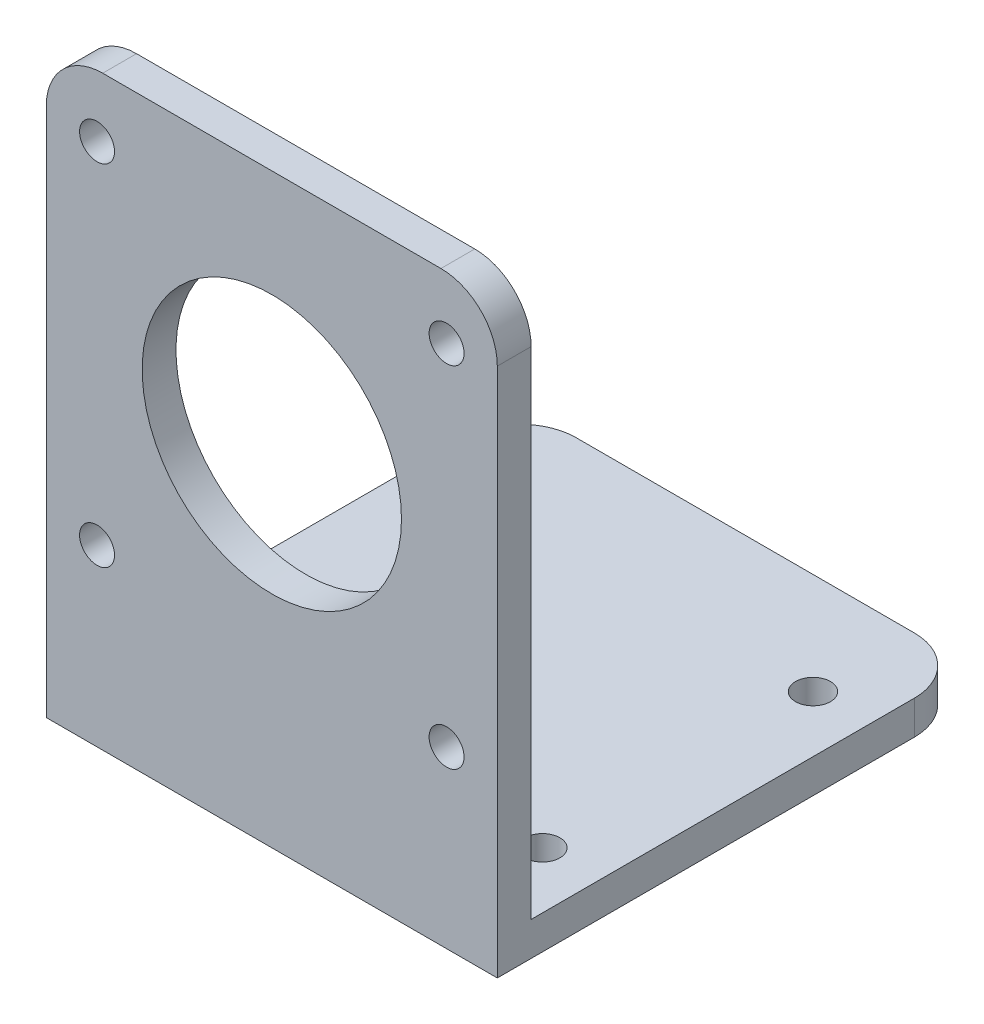
ISO-10303-21;
HEADER;
FILE_DESCRIPTION(('STEP AP214'),'2;1');
FILE_NAME('part.step','',(''),(''),'','','');
FILE_SCHEMA(('AUTOMOTIVE_DESIGN { 1 0 10303 214 1 1 1 1 }'));
ENDSEC;
DATA;
#1=APPLICATION_CONTEXT('core data for automotive mechanical design processes');
#2=APPLICATION_PROTOCOL_DEFINITION('international standard','automotive_design',2000,#1);
#3=PRODUCT_CONTEXT('',#1,'mechanical');
#4=PRODUCT('Part','Part','',(#3));
#5=PRODUCT_RELATED_PRODUCT_CATEGORY('part','',(#4));
#6=PRODUCT_DEFINITION_FORMATION('','',#4);
#7=PRODUCT_DEFINITION_CONTEXT('part definition',#1,'design');
#8=PRODUCT_DEFINITION('design','',#6,#7);
#9=PRODUCT_DEFINITION_SHAPE('','',#8);
#10=(LENGTH_UNIT() NAMED_UNIT(*) SI_UNIT(.MILLI.,.METRE.));
#11=(NAMED_UNIT(*) PLANE_ANGLE_UNIT() SI_UNIT($,.RADIAN.));
#12=(NAMED_UNIT(*) SI_UNIT($,.STERADIAN.) SOLID_ANGLE_UNIT());
#13=UNCERTAINTY_MEASURE_WITH_UNIT(LENGTH_MEASURE(1.E-05),#10,'distance_accuracy_value','');
#14=(GEOMETRIC_REPRESENTATION_CONTEXT(3) GLOBAL_UNCERTAINTY_ASSIGNED_CONTEXT((#13)) GLOBAL_UNIT_ASSIGNED_CONTEXT((#10,
#11,#12)) REPRESENTATION_CONTEXT('',''));
#15=CARTESIAN_POINT('',(0.,0.,0.));
#16=DIRECTION('',(0.,0.,1.));
#17=DIRECTION('',(1.,0.,0.));
#18=AXIS2_PLACEMENT_3D('',#15,#16,#17);
#19=CARTESIAN_POINT('',(-20.,0.,-42.));
#20=DIRECTION('',(0.,-1.,0.));
#21=DIRECTION('',(0.,0.,-1.));
#22=AXIS2_PLACEMENT_3D('',#19,#20,#21);
#23=PLANE('',#22);
#24=CARTESIAN_POINT('',(-15.,0.,-33.));
#25=DIRECTION('',(0.,1.,0.));
#26=DIRECTION('',(0.,0.,-1.));
#27=AXIS2_PLACEMENT_3D('',#24,#25,#26);
#28=CIRCLE('',#27,1.55);
#29=CARTESIAN_POINT('',(-15.,0.,-34.55));
#30=VERTEX_POINT('',#29);
#31=EDGE_CURVE('E247',#30,#30,#28,.T.);
#32=ORIENTED_EDGE('',*,*,#31,.T.);
#33=EDGE_LOOP('',(#32));
#34=FACE_BOUND('',#33,.T.);
#35=CARTESIAN_POINT('',(-15.,0.,-9.));
#36=DIRECTION('',(0.,1.,0.));
#37=DIRECTION('',(0.,0.,-1.));
#38=AXIS2_PLACEMENT_3D('',#35,#36,#37);
#39=CIRCLE('',#38,1.55);
#40=CARTESIAN_POINT('',(-15.,0.,-10.55));
#41=VERTEX_POINT('',#40);
#42=EDGE_CURVE('E246',#41,#41,#39,.T.);
#43=ORIENTED_EDGE('',*,*,#42,.T.);
#44=EDGE_LOOP('',(#43));
#45=FACE_BOUND('',#44,.T.);
#46=CARTESIAN_POINT('',(15.,0.,-9.));
#47=DIRECTION('',(0.,1.,0.));
#48=DIRECTION('',(0.,0.,1.));
#49=AXIS2_PLACEMENT_3D('',#46,#47,#48);
#50=CIRCLE('',#49,1.55);
#51=CARTESIAN_POINT('',(15.,0.,-7.45));
#52=VERTEX_POINT('',#51);
#53=EDGE_CURVE('E253',#52,#52,#50,.T.);
#54=ORIENTED_EDGE('',*,*,#53,.T.);
#55=EDGE_LOOP('',(#54));
#56=FACE_BOUND('',#55,.T.);
#57=CARTESIAN_POINT('',(15.,0.,-33.));
#58=DIRECTION('',(0.,1.,0.));
#59=DIRECTION('',(0.,0.,1.));
#60=AXIS2_PLACEMENT_3D('',#57,#58,#59);
#61=CIRCLE('',#60,1.55);
#62=CARTESIAN_POINT('',(15.,0.,-31.45));
#63=VERTEX_POINT('',#62);
#64=EDGE_CURVE('E239',#63,#63,#61,.T.);
#65=ORIENTED_EDGE('',*,*,#64,.T.);
#66=EDGE_LOOP('',(#65));
#67=FACE_BOUND('',#66,.T.);
#68=DIRECTION('',(1.,0.,0.));
#69=VECTOR('',#68,1.);
#70=CARTESIAN_POINT('',(-20.,0.,-42.));
#71=LINE('',#70,#69);
#72=CARTESIAN_POINT('',(-15.,0.,-42.));
#73=VERTEX_POINT('',#72);
#74=CARTESIAN_POINT('',(15.,0.,-42.));
#75=VERTEX_POINT('',#74);
#76=EDGE_CURVE('E141',#73,#75,#71,.T.);
#77=ORIENTED_EDGE('',*,*,#76,.T.);
#78=CARTESIAN_POINT('',(15.,0.,-37.));
#79=DIRECTION('',(0.,-1.,0.));
#80=DIRECTION('',(0.,0.,-1.));
#81=AXIS2_PLACEMENT_3D('',#78,#79,#80);
#82=CIRCLE('',#81,5.);
#83=CARTESIAN_POINT('',(20.,0.,-37.));
#84=VERTEX_POINT('',#83);
#85=EDGE_CURVE('E11',#75,#84,#82,.T.);
#86=ORIENTED_EDGE('',*,*,#85,.T.);
#87=DIRECTION('',(0.,0.,-1.));
#88=VECTOR('',#87,1.);
#89=CARTESIAN_POINT('',(20.,0.,-42.));
#90=LINE('',#89,#88);
#91=CARTESIAN_POINT('',(20.,0.,0.));
#92=VERTEX_POINT('',#91);
#93=EDGE_CURVE('E145',#92,#84,#90,.T.);
#94=ORIENTED_EDGE('',*,*,#93,.F.);
#95=DIRECTION('',(1.,0.,0.));
#96=VECTOR('',#95,1.);
#97=CARTESIAN_POINT('',(-20.,0.,0.));
#98=LINE('',#97,#96);
#99=CARTESIAN_POINT('',(-20.,0.,0.));
#100=VERTEX_POINT('',#99);
#101=EDGE_CURVE('E154',#100,#92,#98,.T.);
#102=ORIENTED_EDGE('',*,*,#101,.F.);
#103=DIRECTION('',(0.,0.,-1.));
#104=VECTOR('',#103,1.);
#105=CARTESIAN_POINT('',(-20.,0.,-42.));
#106=LINE('',#105,#104);
#107=CARTESIAN_POINT('',(-20.,0.,-37.));
#108=VERTEX_POINT('',#107);
#109=EDGE_CURVE('E124',#100,#108,#106,.T.);
#110=ORIENTED_EDGE('',*,*,#109,.T.);
#111=CARTESIAN_POINT('',(-15.,0.,-37.));
#112=DIRECTION('',(0.,-1.,0.));
#113=DIRECTION('',(0.,0.,-1.));
#114=AXIS2_PLACEMENT_3D('',#111,#112,#113);
#115=CIRCLE('',#114,5.);
#116=EDGE_CURVE('E43',#108,#73,#115,.T.);
#117=ORIENTED_EDGE('',*,*,#116,.T.);
#118=EDGE_LOOP('',(#77,#86,#94,#102,#110,#117));
#119=FACE_BOUND('',#118,.T.);
#120=ADVANCED_FACE('F35',(#34,#45,#56,#67,#119),#23,.T.);
#121=CARTESIAN_POINT('',(-20.,0.,0.));
#122=DIRECTION('',(0.,0.,1.));
#123=DIRECTION('',(1.,0.,0.));
#124=AXIS2_PLACEMENT_3D('',#121,#122,#123);
#125=PLANE('',#124);
#126=CARTESIAN_POINT('',(0.,31.,0.));
#127=DIRECTION('',(0.,0.,1.));
#128=DIRECTION('',(1.,0.,0.));
#129=AXIS2_PLACEMENT_3D('',#126,#127,#128);
#130=CIRCLE('',#129,11.5);
#131=CARTESIAN_POINT('',(11.5,31.,0.));
#132=VERTEX_POINT('',#131);
#133=EDGE_CURVE('E216',#132,#132,#130,.T.);
#134=ORIENTED_EDGE('',*,*,#133,.F.);
#135=EDGE_LOOP('',(#134));
#136=FACE_BOUND('',#135,.T.);
#137=CARTESIAN_POINT('',(-15.5,46.5,0.));
#138=DIRECTION('',(0.,0.,1.));
#139=DIRECTION('',(-1.,0.,0.));
#140=AXIS2_PLACEMENT_3D('',#137,#138,#139);
#141=CIRCLE('',#140,1.55);
#142=CARTESIAN_POINT('',(-17.05,46.5,0.));
#143=VERTEX_POINT('',#142);
#144=EDGE_CURVE('E223',#143,#143,#141,.T.);
#145=ORIENTED_EDGE('',*,*,#144,.F.);
#146=EDGE_LOOP('',(#145));
#147=FACE_BOUND('',#146,.T.);
#148=CARTESIAN_POINT('',(-15.5,15.5,0.));
#149=DIRECTION('',(0.,0.,1.));
#150=DIRECTION('',(-1.,0.,0.));
#151=AXIS2_PLACEMENT_3D('',#148,#149,#150);
#152=CIRCLE('',#151,1.55);
#153=CARTESIAN_POINT('',(-17.05,15.5,0.));
#154=VERTEX_POINT('',#153);
#155=EDGE_CURVE('E229',#154,#154,#152,.T.);
#156=ORIENTED_EDGE('',*,*,#155,.F.);
#157=EDGE_LOOP('',(#156));
#158=FACE_BOUND('',#157,.T.);
#159=CARTESIAN_POINT('',(15.5,15.5,0.));
#160=DIRECTION('',(0.,0.,1.));
#161=DIRECTION('',(1.,0.,0.));
#162=AXIS2_PLACEMENT_3D('',#159,#160,#161);
#163=CIRCLE('',#162,1.55);
#164=CARTESIAN_POINT('',(17.05,15.5,0.));
#165=VERTEX_POINT('',#164);
#166=EDGE_CURVE('E210',#165,#165,#163,.T.);
#167=ORIENTED_EDGE('',*,*,#166,.F.);
#168=EDGE_LOOP('',(#167));
#169=FACE_BOUND('',#168,.T.);
#170=CARTESIAN_POINT('',(15.5,46.5,0.));
#171=DIRECTION('',(0.,0.,1.));
#172=DIRECTION('',(1.,0.,0.));
#173=AXIS2_PLACEMENT_3D('',#170,#171,#172);
#174=CIRCLE('',#173,1.55);
#175=CARTESIAN_POINT('',(17.05,46.5,0.));
#176=VERTEX_POINT('',#175);
#177=EDGE_CURVE('E149',#176,#176,#174,.T.);
#178=ORIENTED_EDGE('',*,*,#177,.F.);
#179=EDGE_LOOP('',(#178));
#180=FACE_BOUND('',#179,.T.);
#181=DIRECTION('',(1.,0.,0.));
#182=VECTOR('',#181,1.);
#183=CARTESIAN_POINT('',(-20.,52.,0.));
#184=LINE('',#183,#182);
#185=CARTESIAN_POINT('',(-15.,52.,0.));
#186=VERTEX_POINT('',#185);
#187=CARTESIAN_POINT('',(15.,52.,0.));
#188=VERTEX_POINT('',#187);
#189=EDGE_CURVE('E158',#186,#188,#184,.T.);
#190=ORIENTED_EDGE('',*,*,#189,.F.);
#191=CARTESIAN_POINT('',(-15.,47.,0.));
#192=DIRECTION('',(0.,0.,1.));
#193=DIRECTION('',(1.,0.,0.));
#194=AXIS2_PLACEMENT_3D('',#191,#192,#193);
#195=CIRCLE('',#194,5.);
#196=CARTESIAN_POINT('',(-20.,47.,0.));
#197=VERTEX_POINT('',#196);
#198=EDGE_CURVE('E171',#186,#197,#195,.T.);
#199=ORIENTED_EDGE('',*,*,#198,.T.);
#200=DIRECTION('',(0.,-1.,0.));
#201=VECTOR('',#200,1.);
#202=CARTESIAN_POINT('',(-20.,0.,0.));
#203=LINE('',#202,#201);
#204=EDGE_CURVE('E139',#197,#100,#203,.T.);
#205=ORIENTED_EDGE('',*,*,#204,.T.);
#206=ORIENTED_EDGE('',*,*,#101,.T.);
#207=DIRECTION('',(0.,-1.,0.));
#208=VECTOR('',#207,1.);
#209=CARTESIAN_POINT('',(20.,0.,0.));
#210=LINE('',#209,#208);
#211=CARTESIAN_POINT('',(20.,47.,0.));
#212=VERTEX_POINT('',#211);
#213=EDGE_CURVE('E152',#212,#92,#210,.T.);
#214=ORIENTED_EDGE('',*,*,#213,.F.);
#215=CARTESIAN_POINT('',(15.,47.,0.));
#216=DIRECTION('',(0.,0.,1.));
#217=DIRECTION('',(1.,0.,0.));
#218=AXIS2_PLACEMENT_3D('',#215,#216,#217);
#219=CIRCLE('',#218,5.);
#220=EDGE_CURVE('E169',#212,#188,#219,.T.);
#221=ORIENTED_EDGE('',*,*,#220,.T.);
#222=EDGE_LOOP('',(#190,#199,#205,#206,#214,#221));
#223=FACE_BOUND('',#222,.T.);
#224=ADVANCED_FACE('F280',(#136,#147,#158,#169,#180,#223),#125,.T.);
#225=CARTESIAN_POINT('',(-20.,52.,0.));
#226=DIRECTION('',(0.,1.,0.));
#227=DIRECTION('',(0.,0.,1.));
#228=AXIS2_PLACEMENT_3D('',#225,#226,#227);
#229=PLANE('',#228);
#230=DIRECTION('',(1.,0.,0.));
#231=VECTOR('',#230,1.);
#232=CARTESIAN_POINT('',(-20.,52.,-3.));
#233=LINE('',#232,#231);
#234=CARTESIAN_POINT('',(-15.,52.,-3.));
#235=VERTEX_POINT('',#234);
#236=CARTESIAN_POINT('',(15.,52.,-3.));
#237=VERTEX_POINT('',#236);
#238=EDGE_CURVE('E132',#235,#237,#233,.T.);
#239=ORIENTED_EDGE('',*,*,#238,.F.);
#240=DIRECTION('',(0.,0.,1.));
#241=VECTOR('',#240,1.);
#242=CARTESIAN_POINT('',(-15.,52.,0.));
#243=LINE('',#242,#241);
#244=EDGE_CURVE('E166',#235,#186,#243,.T.);
#245=ORIENTED_EDGE('',*,*,#244,.T.);
#246=ORIENTED_EDGE('',*,*,#189,.T.);
#247=DIRECTION('',(0.,0.,1.));
#248=VECTOR('',#247,1.);
#249=CARTESIAN_POINT('',(15.,52.,-3.));
#250=LINE('',#249,#248);
#251=EDGE_CURVE('E157',#188,#237,#250,.F.);
#252=ORIENTED_EDGE('',*,*,#251,.T.);
#253=EDGE_LOOP('',(#239,#245,#246,#252));
#254=FACE_BOUND('',#253,.T.);
#255=ADVANCED_FACE('F286',(#254),#229,.T.);
#256=CARTESIAN_POINT('',(-20.,52.,-3.));
#257=DIRECTION('',(0.,0.,-1.));
#258=DIRECTION('',(0.,1.,0.));
#259=AXIS2_PLACEMENT_3D('',#256,#257,#258);
#260=PLANE('',#259);
#261=CARTESIAN_POINT('',(0.,31.,-3.));
#262=DIRECTION('',(0.,0.,-1.));
#263=DIRECTION('',(0.,1.,0.));
#264=AXIS2_PLACEMENT_3D('',#261,#262,#263);
#265=CIRCLE('',#264,11.5);
#266=CARTESIAN_POINT('',(0.,42.5,-2.99999999999999));
#267=VERTEX_POINT('',#266);
#268=EDGE_CURVE('E213',#267,#267,#265,.F.);
#269=ORIENTED_EDGE('',*,*,#268,.T.);
#270=EDGE_LOOP('',(#269));
#271=FACE_BOUND('',#270,.T.);
#272=CARTESIAN_POINT('',(-15.5,46.5,-3.));
#273=DIRECTION('',(0.,0.,-1.));
#274=DIRECTION('',(0.,1.,0.));
#275=AXIS2_PLACEMENT_3D('',#272,#273,#274);
#276=CIRCLE('',#275,1.55);
#277=CARTESIAN_POINT('',(-15.5,48.05,-3.));
#278=VERTEX_POINT('',#277);
#279=EDGE_CURVE('E220',#278,#278,#276,.F.);
#280=ORIENTED_EDGE('',*,*,#279,.T.);
#281=EDGE_LOOP('',(#280));
#282=FACE_BOUND('',#281,.T.);
#283=CARTESIAN_POINT('',(-15.5,15.5,-3.));
#284=DIRECTION('',(0.,0.,-1.));
#285=DIRECTION('',(0.,1.,0.));
#286=AXIS2_PLACEMENT_3D('',#283,#284,#285);
#287=CIRCLE('',#286,1.55);
#288=CARTESIAN_POINT('',(-15.5,17.05,-3.));
#289=VERTEX_POINT('',#288);
#290=EDGE_CURVE('E226',#289,#289,#287,.F.);
#291=ORIENTED_EDGE('',*,*,#290,.T.);
#292=EDGE_LOOP('',(#291));
#293=FACE_BOUND('',#292,.T.);
#294=CARTESIAN_POINT('',(15.5,15.5,-3.));
#295=DIRECTION('',(0.,0.,-1.));
#296=DIRECTION('',(0.,1.,0.));
#297=AXIS2_PLACEMENT_3D('',#294,#295,#296);
#298=CIRCLE('',#297,1.55);
#299=CARTESIAN_POINT('',(15.5,17.05,-3.));
#300=VERTEX_POINT('',#299);
#301=EDGE_CURVE('E232',#300,#300,#298,.F.);
#302=ORIENTED_EDGE('',*,*,#301,.T.);
#303=EDGE_LOOP('',(#302));
#304=FACE_BOUND('',#303,.T.);
#305=CARTESIAN_POINT('',(15.5,46.5,-3.));
#306=DIRECTION('',(0.,0.,-1.));
#307=DIRECTION('',(0.,1.,0.));
#308=AXIS2_PLACEMENT_3D('',#305,#306,#307);
#309=CIRCLE('',#308,1.55);
#310=CARTESIAN_POINT('',(15.5,48.05,-3.));
#311=VERTEX_POINT('',#310);
#312=EDGE_CURVE('E207',#311,#311,#309,.F.);
#313=ORIENTED_EDGE('',*,*,#312,.T.);
#314=EDGE_LOOP('',(#313));
#315=FACE_BOUND('',#314,.T.);
#316=DIRECTION('',(0.,1.,0.));
#317=VECTOR('',#316,1.);
#318=CARTESIAN_POINT('',(-20.,52.,-3.));
#319=LINE('',#318,#317);
#320=CARTESIAN_POINT('',(-20.,3.,-3.00000000000001));
#321=VERTEX_POINT('',#320);
#322=CARTESIAN_POINT('',(-20.,47.,-3.));
#323=VERTEX_POINT('',#322);
#324=EDGE_CURVE('E123',#321,#323,#319,.T.);
#325=ORIENTED_EDGE('',*,*,#324,.T.);
#326=CARTESIAN_POINT('',(-15.,47.,-3.));
#327=DIRECTION('',(0.,0.,-1.));
#328=DIRECTION('',(0.,1.,0.));
#329=AXIS2_PLACEMENT_3D('',#326,#327,#328);
#330=CIRCLE('',#329,5.);
#331=EDGE_CURVE('E178',#323,#235,#330,.T.);
#332=ORIENTED_EDGE('',*,*,#331,.T.);
#333=ORIENTED_EDGE('',*,*,#238,.T.);
#334=CARTESIAN_POINT('',(15.,47.,-3.));
#335=DIRECTION('',(0.,0.,-1.));
#336=DIRECTION('',(0.,1.,0.));
#337=AXIS2_PLACEMENT_3D('',#334,#335,#336);
#338=CIRCLE('',#337,5.);
#339=CARTESIAN_POINT('',(20.,47.,-3.));
#340=VERTEX_POINT('',#339);
#341=EDGE_CURVE('E176',#237,#340,#338,.T.);
#342=ORIENTED_EDGE('',*,*,#341,.T.);
#343=DIRECTION('',(0.,1.,0.));
#344=VECTOR('',#343,1.);
#345=CARTESIAN_POINT('',(20.,52.,-3.));
#346=LINE('',#345,#344);
#347=CARTESIAN_POINT('',(20.,3.,-3.00000000000001));
#348=VERTEX_POINT('',#347);
#349=EDGE_CURVE('E131',#348,#340,#346,.T.);
#350=ORIENTED_EDGE('',*,*,#349,.F.);
#351=DIRECTION('',(1.,0.,0.));
#352=VECTOR('',#351,1.);
#353=CARTESIAN_POINT('',(-20.,3.,-3.00000000000001));
#354=LINE('',#353,#352);
#355=EDGE_CURVE('E116',#321,#348,#354,.T.);
#356=ORIENTED_EDGE('',*,*,#355,.F.);
#357=EDGE_LOOP('',(#325,#332,#333,#342,#350,#356));
#358=FACE_BOUND('',#357,.T.);
#359=ADVANCED_FACE('F128',(#271,#282,#293,#304,#315,#358),#260,.T.);
#360=CARTESIAN_POINT('',(-20.,3.,-3.00000000000001));
#361=DIRECTION('',(0.,1.,0.));
#362=DIRECTION('',(0.,0.,1.));
#363=AXIS2_PLACEMENT_3D('',#360,#361,#362);
#364=PLANE('',#363);
#365=CARTESIAN_POINT('',(-15.,3.,-33.));
#366=DIRECTION('',(0.,1.,0.));
#367=DIRECTION('',(0.,0.,1.));
#368=AXIS2_PLACEMENT_3D('',#365,#366,#367);
#369=CIRCLE('',#368,1.55);
#370=CARTESIAN_POINT('',(-15.,3.,-31.45));
#371=VERTEX_POINT('',#370);
#372=EDGE_CURVE('E243',#371,#371,#369,.T.);
#373=ORIENTED_EDGE('',*,*,#372,.F.);
#374=EDGE_LOOP('',(#373));
#375=FACE_BOUND('',#374,.T.);
#376=CARTESIAN_POINT('',(-15.,3.,-9.));
#377=DIRECTION('',(0.,1.,0.));
#378=DIRECTION('',(0.,0.,1.));
#379=AXIS2_PLACEMENT_3D('',#376,#377,#378);
#380=CIRCLE('',#379,1.55);
#381=CARTESIAN_POINT('',(-15.,3.,-7.45));
#382=VERTEX_POINT('',#381);
#383=EDGE_CURVE('E250',#382,#382,#380,.T.);
#384=ORIENTED_EDGE('',*,*,#383,.F.);
#385=EDGE_LOOP('',(#384));
#386=FACE_BOUND('',#385,.T.);
#387=CARTESIAN_POINT('',(15.,3.,-9.));
#388=DIRECTION('',(0.,1.,0.));
#389=DIRECTION('',(0.,0.,1.));
#390=AXIS2_PLACEMENT_3D('',#387,#388,#389);
#391=CIRCLE('',#390,1.55);
#392=CARTESIAN_POINT('',(15.,3.,-7.45));
#393=VERTEX_POINT('',#392);
#394=EDGE_CURVE('E242',#393,#393,#391,.T.);
#395=ORIENTED_EDGE('',*,*,#394,.F.);
#396=EDGE_LOOP('',(#395));
#397=FACE_BOUND('',#396,.T.);
#398=CARTESIAN_POINT('',(15.,3.,-33.));
#399=DIRECTION('',(0.,1.,0.));
#400=DIRECTION('',(0.,0.,1.));
#401=AXIS2_PLACEMENT_3D('',#398,#399,#400);
#402=CIRCLE('',#401,1.55);
#403=CARTESIAN_POINT('',(15.,3.,-31.45));
#404=VERTEX_POINT('',#403);
#405=EDGE_CURVE('E217',#404,#404,#402,.T.);
#406=ORIENTED_EDGE('',*,*,#405,.F.);
#407=EDGE_LOOP('',(#406));
#408=FACE_BOUND('',#407,.T.);
#409=DIRECTION('',(0.,0.,1.));
#410=VECTOR('',#409,1.);
#411=CARTESIAN_POINT('',(20.,3.,-3.00000000000001));
#412=LINE('',#411,#410);
#413=CARTESIAN_POINT('',(20.,3.,-37.));
#414=VERTEX_POINT('',#413);
#415=EDGE_CURVE('E148',#414,#348,#412,.T.);
#416=ORIENTED_EDGE('',*,*,#415,.F.);
#417=CARTESIAN_POINT('',(15.,3.,-37.));
#418=DIRECTION('',(0.,1.,0.));
#419=DIRECTION('',(0.,0.,1.));
#420=AXIS2_PLACEMENT_3D('',#417,#418,#419);
#421=CIRCLE('',#420,5.);
#422=CARTESIAN_POINT('',(15.,3.,-42.));
#423=VERTEX_POINT('',#422);
#424=EDGE_CURVE('E187',#414,#423,#421,.T.);
#425=ORIENTED_EDGE('',*,*,#424,.T.);
#426=DIRECTION('',(1.,0.,0.));
#427=VECTOR('',#426,1.);
#428=CARTESIAN_POINT('',(-20.,3.,-42.));
#429=LINE('',#428,#427);
#430=CARTESIAN_POINT('',(-15.,3.,-42.));
#431=VERTEX_POINT('',#430);
#432=EDGE_CURVE('E133',#431,#423,#429,.T.);
#433=ORIENTED_EDGE('',*,*,#432,.F.);
#434=CARTESIAN_POINT('',(-15.,3.,-37.));
#435=DIRECTION('',(0.,1.,0.));
#436=DIRECTION('',(0.,0.,1.));
#437=AXIS2_PLACEMENT_3D('',#434,#435,#436);
#438=CIRCLE('',#437,5.);
#439=CARTESIAN_POINT('',(-20.,3.,-37.));
#440=VERTEX_POINT('',#439);
#441=EDGE_CURVE('E119',#431,#440,#438,.T.);
#442=ORIENTED_EDGE('',*,*,#441,.T.);
#443=DIRECTION('',(0.,0.,1.));
#444=VECTOR('',#443,1.);
#445=CARTESIAN_POINT('',(-20.,3.,-3.00000000000001));
#446=LINE('',#445,#444);
#447=EDGE_CURVE('E112',#440,#321,#446,.T.);
#448=ORIENTED_EDGE('',*,*,#447,.T.);
#449=ORIENTED_EDGE('',*,*,#355,.T.);
#450=EDGE_LOOP('',(#416,#425,#433,#442,#448,#449));
#451=FACE_BOUND('',#450,.T.);
#452=ADVANCED_FACE('F115',(#375,#386,#397,#408,#451),#364,.T.);
#453=CARTESIAN_POINT('',(-20.,3.,-42.));
#454=DIRECTION('',(0.,0.,-1.));
#455=DIRECTION('',(-1.,0.,0.));
#456=AXIS2_PLACEMENT_3D('',#453,#454,#455);
#457=PLANE('',#456);
#458=ORIENTED_EDGE('',*,*,#432,.T.);
#459=DIRECTION('',(0.,1.,0.));
#460=VECTOR('',#459,1.);
#461=CARTESIAN_POINT('',(15.,0.,-42.));
#462=LINE('',#461,#460);
#463=EDGE_CURVE('E50',#423,#75,#462,.F.);
#464=ORIENTED_EDGE('',*,*,#463,.T.);
#465=ORIENTED_EDGE('',*,*,#76,.F.);
#466=DIRECTION('',(0.,1.,0.));
#467=VECTOR('',#466,1.);
#468=CARTESIAN_POINT('',(-15.,3.,-42.));
#469=LINE('',#468,#467);
#470=EDGE_CURVE('E189',#73,#431,#469,.T.);
#471=ORIENTED_EDGE('',*,*,#470,.T.);
#472=EDGE_LOOP('',(#458,#464,#465,#471));
#473=FACE_BOUND('',#472,.T.);
#474=ADVANCED_FACE('F193',(#473),#457,.T.);
#475=CARTESIAN_POINT('',(-20.,0.,0.));
#476=DIRECTION('',(-1.,0.,0.));
#477=DIRECTION('',(0.,0.,1.));
#478=AXIS2_PLACEMENT_3D('',#475,#476,#477);
#479=PLANE('',#478);
#480=ORIENTED_EDGE('',*,*,#204,.F.);
#481=DIRECTION('',(0.,0.,1.));
#482=VECTOR('',#481,1.);
#483=CARTESIAN_POINT('',(-20.,47.,0.));
#484=LINE('',#483,#482);
#485=EDGE_CURVE('E138',#197,#323,#484,.F.);
#486=ORIENTED_EDGE('',*,*,#485,.T.);
#487=ORIENTED_EDGE('',*,*,#324,.F.);
#488=ORIENTED_EDGE('',*,*,#447,.F.);
#489=DIRECTION('',(0.,1.,0.));
#490=VECTOR('',#489,1.);
#491=CARTESIAN_POINT('',(-20.,0.,-37.));
#492=LINE('',#491,#490);
#493=EDGE_CURVE('E173',#440,#108,#492,.F.);
#494=ORIENTED_EDGE('',*,*,#493,.T.);
#495=ORIENTED_EDGE('',*,*,#109,.F.);
#496=EDGE_LOOP('',(#480,#486,#487,#488,#494,#495));
#497=FACE_BOUND('',#496,.T.);
#498=ADVANCED_FACE('F136',(#497),#479,.T.);
#499=CARTESIAN_POINT('',(20.,0.,0.));
#500=DIRECTION('',(-1.,0.,0.));
#501=DIRECTION('',(0.,0.,1.));
#502=AXIS2_PLACEMENT_3D('',#499,#500,#501);
#503=PLANE('',#502);
#504=ORIENTED_EDGE('',*,*,#349,.T.);
#505=DIRECTION('',(0.,0.,1.));
#506=VECTOR('',#505,1.);
#507=CARTESIAN_POINT('',(20.,47.,0.));
#508=LINE('',#507,#506);
#509=EDGE_CURVE('E183',#340,#212,#508,.T.);
#510=ORIENTED_EDGE('',*,*,#509,.T.);
#511=ORIENTED_EDGE('',*,*,#213,.T.);
#512=ORIENTED_EDGE('',*,*,#93,.T.);
#513=DIRECTION('',(0.,1.,0.));
#514=VECTOR('',#513,1.);
#515=CARTESIAN_POINT('',(20.,3.,-37.));
#516=LINE('',#515,#514);
#517=EDGE_CURVE('E180',#84,#414,#516,.T.);
#518=ORIENTED_EDGE('',*,*,#517,.T.);
#519=ORIENTED_EDGE('',*,*,#415,.T.);
#520=EDGE_LOOP('',(#504,#510,#511,#512,#518,#519));
#521=FACE_BOUND('',#520,.T.);
#522=ADVANCED_FACE('F200',(#521),#503,.F.);
#523=CARTESIAN_POINT('',(15.5,46.5,-42.001));
#524=DIRECTION('',(0.,0.,1.));
#525=DIRECTION('',(1.,0.,0.));
#526=AXIS2_PLACEMENT_3D('',#523,#524,#525);
#527=CYLINDRICAL_SURFACE('',#526,1.55);
#528=ORIENTED_EDGE('',*,*,#312,.F.);
#529=EDGE_LOOP('',(#528));
#530=FACE_BOUND('',#529,.T.);
#531=ORIENTED_EDGE('',*,*,#177,.T.);
#532=EDGE_LOOP('',(#531));
#533=FACE_BOUND('',#532,.T.);
#534=ADVANCED_FACE('F333',(#530,#533),#527,.F.);
#535=CARTESIAN_POINT('',(15.5,15.5,-42.001));
#536=DIRECTION('',(0.,0.,1.));
#537=DIRECTION('',(1.,0.,0.));
#538=AXIS2_PLACEMENT_3D('',#535,#536,#537);
#539=CYLINDRICAL_SURFACE('',#538,1.55);
#540=ORIENTED_EDGE('',*,*,#301,.F.);
#541=EDGE_LOOP('',(#540));
#542=FACE_BOUND('',#541,.T.);
#543=ORIENTED_EDGE('',*,*,#166,.T.);
#544=EDGE_LOOP('',(#543));
#545=FACE_BOUND('',#544,.T.);
#546=ADVANCED_FACE('F438',(#542,#545),#539,.F.);
#547=CARTESIAN_POINT('',(-15.5,15.5,-42.001));
#548=DIRECTION('',(0.,0.,1.));
#549=DIRECTION('',(1.,0.,0.));
#550=AXIS2_PLACEMENT_3D('',#547,#548,#549);
#551=CYLINDRICAL_SURFACE('',#550,1.55);
#552=ORIENTED_EDGE('',*,*,#290,.F.);
#553=EDGE_LOOP('',(#552));
#554=FACE_BOUND('',#553,.T.);
#555=ORIENTED_EDGE('',*,*,#155,.T.);
#556=EDGE_LOOP('',(#555));
#557=FACE_BOUND('',#556,.T.);
#558=ADVANCED_FACE('F428',(#554,#557),#551,.F.);
#559=CARTESIAN_POINT('',(-15.5,46.5,-42.001));
#560=DIRECTION('',(0.,0.,1.));
#561=DIRECTION('',(1.,0.,0.));
#562=AXIS2_PLACEMENT_3D('',#559,#560,#561);
#563=CYLINDRICAL_SURFACE('',#562,1.55);
#564=ORIENTED_EDGE('',*,*,#279,.F.);
#565=EDGE_LOOP('',(#564));
#566=FACE_BOUND('',#565,.T.);
#567=ORIENTED_EDGE('',*,*,#144,.T.);
#568=EDGE_LOOP('',(#567));
#569=FACE_BOUND('',#568,.T.);
#570=ADVANCED_FACE('F418',(#566,#569),#563,.F.);
#571=CARTESIAN_POINT('',(0.,31.,-42.001));
#572=DIRECTION('',(0.,0.,1.));
#573=DIRECTION('',(1.,0.,0.));
#574=AXIS2_PLACEMENT_3D('',#571,#572,#573);
#575=CYLINDRICAL_SURFACE('',#574,11.5);
#576=ORIENTED_EDGE('',*,*,#268,.F.);
#577=EDGE_LOOP('',(#576));
#578=FACE_BOUND('',#577,.T.);
#579=ORIENTED_EDGE('',*,*,#133,.T.);
#580=EDGE_LOOP('',(#579));
#581=FACE_BOUND('',#580,.T.);
#582=ADVANCED_FACE('F276',(#578,#581),#575,.F.);
#583=CARTESIAN_POINT('',(15.,52.001,-33.));
#584=DIRECTION('',(0.,-1.,0.));
#585=DIRECTION('',(0.,0.,-1.));
#586=AXIS2_PLACEMENT_3D('',#583,#584,#585);
#587=CYLINDRICAL_SURFACE('',#586,1.55);
#588=ORIENTED_EDGE('',*,*,#405,.T.);
#589=EDGE_LOOP('',(#588));
#590=FACE_BOUND('',#589,.T.);
#591=ORIENTED_EDGE('',*,*,#64,.F.);
#592=EDGE_LOOP('',(#591));
#593=FACE_BOUND('',#592,.T.);
#594=ADVANCED_FACE('F266',(#590,#593),#587,.F.);
#595=CARTESIAN_POINT('',(15.,52.001,-9.));
#596=DIRECTION('',(0.,-1.,0.));
#597=DIRECTION('',(0.,0.,-1.));
#598=AXIS2_PLACEMENT_3D('',#595,#596,#597);
#599=CYLINDRICAL_SURFACE('',#598,1.55);
#600=ORIENTED_EDGE('',*,*,#394,.T.);
#601=EDGE_LOOP('',(#600));
#602=FACE_BOUND('',#601,.T.);
#603=ORIENTED_EDGE('',*,*,#53,.F.);
#604=EDGE_LOOP('',(#603));
#605=FACE_BOUND('',#604,.T.);
#606=ADVANCED_FACE('F263',(#602,#605),#599,.F.);
#607=CARTESIAN_POINT('',(-15.,52.001,-9.));
#608=DIRECTION('',(0.,-1.,0.));
#609=DIRECTION('',(0.,0.,-1.));
#610=AXIS2_PLACEMENT_3D('',#607,#608,#609);
#611=CYLINDRICAL_SURFACE('',#610,1.55);
#612=ORIENTED_EDGE('',*,*,#383,.T.);
#613=EDGE_LOOP('',(#612));
#614=FACE_BOUND('',#613,.T.);
#615=ORIENTED_EDGE('',*,*,#42,.F.);
#616=EDGE_LOOP('',(#615));
#617=FACE_BOUND('',#616,.T.);
#618=ADVANCED_FACE('F265',(#614,#617),#611,.F.);
#619=CARTESIAN_POINT('',(-15.,52.001,-33.));
#620=DIRECTION('',(0.,-1.,0.));
#621=DIRECTION('',(0.,0.,-1.));
#622=AXIS2_PLACEMENT_3D('',#619,#620,#621);
#623=CYLINDRICAL_SURFACE('',#622,1.55);
#624=ORIENTED_EDGE('',*,*,#372,.T.);
#625=EDGE_LOOP('',(#624));
#626=FACE_BOUND('',#625,.T.);
#627=ORIENTED_EDGE('',*,*,#31,.F.);
#628=EDGE_LOOP('',(#627));
#629=FACE_BOUND('',#628,.T.);
#630=ADVANCED_FACE('F273',(#626,#629),#623,.F.);
#631=CARTESIAN_POINT('',(-15.,47.,0.));
#632=DIRECTION('',(0.,0.,1.));
#633=DIRECTION('',(1.,0.,0.));
#634=AXIS2_PLACEMENT_3D('',#631,#632,#633);
#635=CYLINDRICAL_SURFACE('',#634,5.);
#636=ORIENTED_EDGE('',*,*,#331,.F.);
#637=ORIENTED_EDGE('',*,*,#485,.F.);
#638=ORIENTED_EDGE('',*,*,#198,.F.);
#639=ORIENTED_EDGE('',*,*,#244,.F.);
#640=EDGE_LOOP('',(#636,#637,#638,#639));
#641=FACE_BOUND('',#640,.T.);
#642=ADVANCED_FACE('F293',(#641),#635,.T.);
#643=CARTESIAN_POINT('',(15.,47.,0.));
#644=DIRECTION('',(0.,0.,-1.));
#645=DIRECTION('',(-1.,0.,0.));
#646=AXIS2_PLACEMENT_3D('',#643,#644,#645);
#647=CYLINDRICAL_SURFACE('',#646,5.);
#648=ORIENTED_EDGE('',*,*,#341,.F.);
#649=ORIENTED_EDGE('',*,*,#251,.F.);
#650=ORIENTED_EDGE('',*,*,#220,.F.);
#651=ORIENTED_EDGE('',*,*,#509,.F.);
#652=EDGE_LOOP('',(#648,#649,#650,#651));
#653=FACE_BOUND('',#652,.T.);
#654=ADVANCED_FACE('F296',(#653),#647,.T.);
#655=CARTESIAN_POINT('',(15.,0.,-37.));
#656=DIRECTION('',(0.,-1.,0.));
#657=DIRECTION('',(0.,0.,-1.));
#658=AXIS2_PLACEMENT_3D('',#655,#656,#657);
#659=CYLINDRICAL_SURFACE('',#658,5.);
#660=ORIENTED_EDGE('',*,*,#85,.F.);
#661=ORIENTED_EDGE('',*,*,#463,.F.);
#662=ORIENTED_EDGE('',*,*,#424,.F.);
#663=ORIENTED_EDGE('',*,*,#517,.F.);
#664=EDGE_LOOP('',(#660,#661,#662,#663));
#665=FACE_BOUND('',#664,.T.);
#666=ADVANCED_FACE('F198',(#665),#659,.T.);
#667=CARTESIAN_POINT('',(-15.,3.,-37.));
#668=DIRECTION('',(0.,1.,0.));
#669=DIRECTION('',(0.,0.,1.));
#670=AXIS2_PLACEMENT_3D('',#667,#668,#669);
#671=CYLINDRICAL_SURFACE('',#670,5.);
#672=ORIENTED_EDGE('',*,*,#116,.F.);
#673=ORIENTED_EDGE('',*,*,#493,.F.);
#674=ORIENTED_EDGE('',*,*,#441,.F.);
#675=ORIENTED_EDGE('',*,*,#470,.F.);
#676=EDGE_LOOP('',(#672,#673,#674,#675));
#677=FACE_BOUND('',#676,.T.);
#678=ADVANCED_FACE('F37',(#677),#671,.T.);
#679=CLOSED_SHELL('',(#120,#224,#255,#359,#452,#474,#498,#522,#534,#546,#558,#570,#582,#594,
#606,#618,#630,#642,#654,#666,#678));
#680=MANIFOLD_SOLID_BREP('B2',#679);
#681=ADVANCED_BREP_SHAPE_REPRESENTATION('',(#18,#680),#14);
#682=SHAPE_DEFINITION_REPRESENTATION(#9,#681);
ENDSEC;
END-ISO-10303-21;
